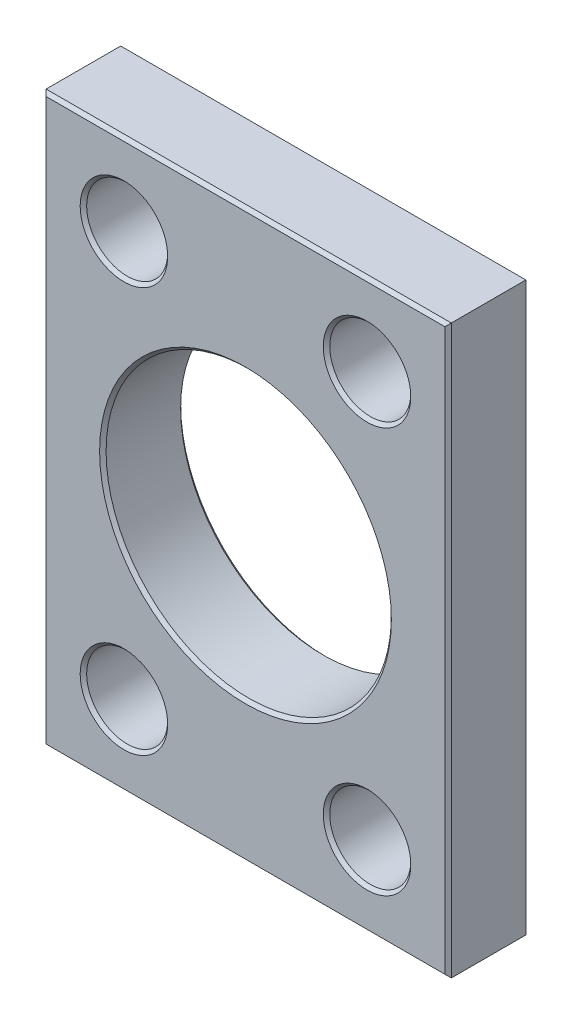
ISO-10303-21;
HEADER;
FILE_DESCRIPTION(('STEP AP214'),'2;1');
FILE_NAME('part.step','',(''),(''),'','','');
FILE_SCHEMA(('AUTOMOTIVE_DESIGN { 1 0 10303 214 1 1 1 1 }'));
ENDSEC;
DATA;
#1=APPLICATION_CONTEXT('core data for automotive mechanical design processes');
#2=APPLICATION_PROTOCOL_DEFINITION('international standard','automotive_design',2000,#1);
#3=PRODUCT_CONTEXT('',#1,'mechanical');
#4=PRODUCT('Part','Part','',(#3));
#5=PRODUCT_RELATED_PRODUCT_CATEGORY('part','',(#4));
#6=PRODUCT_DEFINITION_FORMATION('','',#4);
#7=PRODUCT_DEFINITION_CONTEXT('part definition',#1,'design');
#8=PRODUCT_DEFINITION('design','',#6,#7);
#9=PRODUCT_DEFINITION_SHAPE('','',#8);
#10=(LENGTH_UNIT() NAMED_UNIT(*) SI_UNIT(.MILLI.,.METRE.));
#11=(NAMED_UNIT(*) PLANE_ANGLE_UNIT() SI_UNIT($,.RADIAN.));
#12=(NAMED_UNIT(*) SI_UNIT($,.STERADIAN.) SOLID_ANGLE_UNIT());
#13=UNCERTAINTY_MEASURE_WITH_UNIT(LENGTH_MEASURE(1.E-05),#10,'distance_accuracy_value','');
#14=(GEOMETRIC_REPRESENTATION_CONTEXT(3) GLOBAL_UNCERTAINTY_ASSIGNED_CONTEXT((#13)) GLOBAL_UNIT_ASSIGNED_CONTEXT((#10,
#11,#12)) REPRESENTATION_CONTEXT('',''));
#15=CARTESIAN_POINT('',(0.,0.,0.));
#16=DIRECTION('',(0.,0.,1.));
#17=DIRECTION('',(1.,0.,0.));
#18=AXIS2_PLACEMENT_3D('',#15,#16,#17);
#19=CARTESIAN_POINT('',(0.,0.,6.35));
#20=DIRECTION('',(0.,0.,-1.));
#21=DIRECTION('',(-1.,0.,0.));
#22=AXIS2_PLACEMENT_3D('',#19,#20,#21);
#23=PLANE('',#22);
#24=CARTESIAN_POINT('',(0.,0.,6.35));
#25=DIRECTION('',(0.,0.,-1.));
#26=DIRECTION('',(-1.,0.,0.));
#27=AXIS2_PLACEMENT_3D('',#24,#25,#26);
#28=CIRCLE('',#27,11.43);
#29=CARTESIAN_POINT('',(-11.43,0.,6.35));
#30=VERTEX_POINT('',#29);
#31=EDGE_CURVE('E11',#30,#30,#28,.T.);
#32=ORIENTED_EDGE('',*,*,#31,.T.);
#33=EDGE_LOOP('',(#32));
#34=FACE_BOUND('',#33,.T.);
#35=CARTESIAN_POINT('',(9.525,-15.875,6.35));
#36=DIRECTION('',(0.,0.,-1.));
#37=DIRECTION('',(-1.,0.,0.));
#38=AXIS2_PLACEMENT_3D('',#35,#36,#37);
#39=CIRCLE('',#38,3.429);
#40=CARTESIAN_POINT('',(6.09599999999999,-15.875,6.35));
#41=VERTEX_POINT('',#40);
#42=EDGE_CURVE('E42',#41,#41,#39,.T.);
#43=ORIENTED_EDGE('',*,*,#42,.T.);
#44=EDGE_LOOP('',(#43));
#45=FACE_BOUND('',#44,.T.);
#46=CARTESIAN_POINT('',(-9.525,-15.875,6.35));
#47=DIRECTION('',(0.,0.,-1.));
#48=DIRECTION('',(-1.,0.,0.));
#49=AXIS2_PLACEMENT_3D('',#46,#47,#48);
#50=CIRCLE('',#49,3.429);
#51=CARTESIAN_POINT('',(-12.954,-15.875,6.35));
#52=VERTEX_POINT('',#51);
#53=EDGE_CURVE('E199',#52,#52,#50,.T.);
#54=ORIENTED_EDGE('',*,*,#53,.T.);
#55=EDGE_LOOP('',(#54));
#56=FACE_BOUND('',#55,.T.);
#57=CARTESIAN_POINT('',(9.525,15.875,6.35));
#58=DIRECTION('',(0.,0.,-1.));
#59=DIRECTION('',(-1.,0.,0.));
#60=AXIS2_PLACEMENT_3D('',#57,#58,#59);
#61=CIRCLE('',#60,3.429);
#62=CARTESIAN_POINT('',(6.096,15.875,6.35));
#63=VERTEX_POINT('',#62);
#64=EDGE_CURVE('E196',#63,#63,#61,.T.);
#65=ORIENTED_EDGE('',*,*,#64,.T.);
#66=EDGE_LOOP('',(#65));
#67=FACE_BOUND('',#66,.T.);
#68=CARTESIAN_POINT('',(-9.525,15.875,6.35));
#69=DIRECTION('',(0.,0.,-1.));
#70=DIRECTION('',(-1.,0.,0.));
#71=AXIS2_PLACEMENT_3D('',#68,#69,#70);
#72=CIRCLE('',#71,3.429);
#73=CARTESIAN_POINT('',(-12.954,15.875,6.35));
#74=VERTEX_POINT('',#73);
#75=EDGE_CURVE('E193',#74,#74,#72,.T.);
#76=ORIENTED_EDGE('',*,*,#75,.T.);
#77=EDGE_LOOP('',(#76));
#78=FACE_BOUND('',#77,.T.);
#79=DIRECTION('',(0.,-1.,0.));
#80=VECTOR('',#79,1.);
#81=CARTESIAN_POINT('',(-15.621,0.,6.35));
#82=LINE('',#81,#80);
#83=CARTESIAN_POINT('',(-15.621,21.971,6.35));
#84=VERTEX_POINT('',#83);
#85=CARTESIAN_POINT('',(-15.621,-21.971,6.35));
#86=VERTEX_POINT('',#85);
#87=EDGE_CURVE('E50',#84,#86,#82,.T.);
#88=ORIENTED_EDGE('',*,*,#87,.T.);
#89=DIRECTION('',(1.,0.,0.));
#90=VECTOR('',#89,1.);
#91=CARTESIAN_POINT('',(0.,-21.971,6.35));
#92=LINE('',#91,#90);
#93=CARTESIAN_POINT('',(15.621,-21.971,6.35));
#94=VERTEX_POINT('',#93);
#95=EDGE_CURVE('E191',#86,#94,#92,.T.);
#96=ORIENTED_EDGE('',*,*,#95,.T.);
#97=DIRECTION('',(0.,1.,0.));
#98=VECTOR('',#97,1.);
#99=CARTESIAN_POINT('',(15.621,0.,6.35));
#100=LINE('',#99,#98);
#101=CARTESIAN_POINT('',(15.621,21.971,6.35));
#102=VERTEX_POINT('',#101);
#103=EDGE_CURVE('E187',#94,#102,#100,.T.);
#104=ORIENTED_EDGE('',*,*,#103,.T.);
#105=DIRECTION('',(-1.,0.,0.));
#106=VECTOR('',#105,1.);
#107=CARTESIAN_POINT('',(0.,21.971,6.35));
#108=LINE('',#107,#106);
#109=EDGE_CURVE('E55',#102,#84,#108,.T.);
#110=ORIENTED_EDGE('',*,*,#109,.T.);
#111=EDGE_LOOP('',(#88,#96,#104,#110));
#112=FACE_BOUND('',#111,.T.);
#113=ADVANCED_FACE('F33',(#34,#45,#56,#67,#78,#112),#23,.F.);
#114=CARTESIAN_POINT('',(0.,0.,0.));
#115=DIRECTION('',(0.,0.,-1.));
#116=DIRECTION('',(-1.,0.,0.));
#117=AXIS2_PLACEMENT_3D('',#114,#115,#116);
#118=PLANE('',#117);
#119=CARTESIAN_POINT('',(0.,0.,0.));
#120=DIRECTION('',(0.,0.,-1.));
#121=DIRECTION('',(-1.,0.,0.));
#122=AXIS2_PLACEMENT_3D('',#119,#120,#121);
#123=CIRCLE('',#122,11.43);
#124=CARTESIAN_POINT('',(-11.43,0.,0.));
#125=VERTEX_POINT('',#124);
#126=EDGE_CURVE('E138',#125,#125,#123,.F.);
#127=ORIENTED_EDGE('',*,*,#126,.T.);
#128=EDGE_LOOP('',(#127));
#129=FACE_BOUND('',#128,.T.);
#130=CARTESIAN_POINT('',(-9.525,-15.875,0.));
#131=DIRECTION('',(0.,0.,-1.));
#132=DIRECTION('',(-1.,0.,0.));
#133=AXIS2_PLACEMENT_3D('',#130,#131,#132);
#134=CIRCLE('',#133,3.429);
#135=CARTESIAN_POINT('',(-12.954,-15.875,0.));
#136=VERTEX_POINT('',#135);
#137=EDGE_CURVE('E131',#136,#136,#134,.F.);
#138=ORIENTED_EDGE('',*,*,#137,.T.);
#139=EDGE_LOOP('',(#138));
#140=FACE_BOUND('',#139,.T.);
#141=CARTESIAN_POINT('',(-9.525,15.875,0.));
#142=DIRECTION('',(0.,0.,-1.));
#143=DIRECTION('',(-1.,0.,0.));
#144=AXIS2_PLACEMENT_3D('',#141,#142,#143);
#145=CIRCLE('',#144,3.429);
#146=CARTESIAN_POINT('',(-12.954,15.875,0.));
#147=VERTEX_POINT('',#146);
#148=EDGE_CURVE('E128',#147,#147,#145,.F.);
#149=ORIENTED_EDGE('',*,*,#148,.T.);
#150=EDGE_LOOP('',(#149));
#151=FACE_BOUND('',#150,.T.);
#152=DIRECTION('',(0.,1.,0.));
#153=VECTOR('',#152,1.);
#154=CARTESIAN_POINT('',(-15.621,22.225,0.));
#155=LINE('',#154,#153);
#156=CARTESIAN_POINT('',(-15.621,-21.971,0.));
#157=VERTEX_POINT('',#156);
#158=CARTESIAN_POINT('',(-15.621,21.971,0.));
#159=VERTEX_POINT('',#158);
#160=EDGE_CURVE('E127',#157,#159,#155,.T.);
#161=ORIENTED_EDGE('',*,*,#160,.T.);
#162=DIRECTION('',(1.,0.,0.));
#163=VECTOR('',#162,1.);
#164=CARTESIAN_POINT('',(15.875,21.971,0.));
#165=LINE('',#164,#163);
#166=CARTESIAN_POINT('',(15.621,21.971,0.));
#167=VERTEX_POINT('',#166);
#168=EDGE_CURVE('E105',#159,#167,#165,.T.);
#169=ORIENTED_EDGE('',*,*,#168,.T.);
#170=DIRECTION('',(0.,-1.,0.));
#171=VECTOR('',#170,1.);
#172=CARTESIAN_POINT('',(15.621,-22.225,0.));
#173=LINE('',#172,#171);
#174=CARTESIAN_POINT('',(15.621,-21.971,0.));
#175=VERTEX_POINT('',#174);
#176=EDGE_CURVE('E115',#167,#175,#173,.T.);
#177=ORIENTED_EDGE('',*,*,#176,.T.);
#178=DIRECTION('',(-1.,0.,0.));
#179=VECTOR('',#178,1.);
#180=CARTESIAN_POINT('',(-15.875,-21.971,0.));
#181=LINE('',#180,#179);
#182=EDGE_CURVE('E121',#175,#157,#181,.T.);
#183=ORIENTED_EDGE('',*,*,#182,.T.);
#184=EDGE_LOOP('',(#161,#169,#177,#183));
#185=FACE_BOUND('',#184,.T.);
#186=CARTESIAN_POINT('',(9.525,15.875,0.));
#187=DIRECTION('',(0.,0.,-1.));
#188=DIRECTION('',(-1.,0.,0.));
#189=AXIS2_PLACEMENT_3D('',#186,#187,#188);
#190=CIRCLE('',#189,3.42899999999999);
#191=CARTESIAN_POINT('',(6.09600000000001,15.875,0.));
#192=VERTEX_POINT('',#191);
#193=EDGE_CURVE('E122',#192,#192,#190,.F.);
#194=ORIENTED_EDGE('',*,*,#193,.T.);
#195=EDGE_LOOP('',(#194));
#196=FACE_BOUND('',#195,.T.);
#197=CARTESIAN_POINT('',(9.525,-15.875,0.));
#198=DIRECTION('',(0.,0.,-1.));
#199=DIRECTION('',(-1.,0.,0.));
#200=AXIS2_PLACEMENT_3D('',#197,#198,#199);
#201=CIRCLE('',#200,3.429);
#202=CARTESIAN_POINT('',(6.09599999999999,-15.875,0.));
#203=VERTEX_POINT('',#202);
#204=EDGE_CURVE('E236',#203,#203,#201,.F.);
#205=ORIENTED_EDGE('',*,*,#204,.T.);
#206=EDGE_LOOP('',(#205));
#207=FACE_BOUND('',#206,.T.);
#208=ADVANCED_FACE('F124',(#129,#140,#151,#185,#196,#207),#118,.T.);
#209=CARTESIAN_POINT('',(15.875,-22.225,6.35));
#210=DIRECTION('',(-1.,0.,0.));
#211=DIRECTION('',(0.,-1.,0.));
#212=AXIS2_PLACEMENT_3D('',#209,#210,#211);
#213=PLANE('',#212);
#214=DIRECTION('',(0.,0.,-1.));
#215=VECTOR('',#214,1.);
#216=CARTESIAN_POINT('',(15.875,-22.225,6.35));
#217=LINE('',#216,#215);
#218=CARTESIAN_POINT('',(15.875,-22.225,6.096));
#219=VERTEX_POINT('',#218);
#220=CARTESIAN_POINT('',(15.875,-22.225,0.253999999999997));
#221=VERTEX_POINT('',#220);
#222=EDGE_CURVE('E208',#219,#221,#217,.T.);
#223=ORIENTED_EDGE('',*,*,#222,.T.);
#224=DIRECTION('',(0.,1.,0.));
#225=VECTOR('',#224,1.);
#226=CARTESIAN_POINT('',(15.875,22.225,0.253999999999997));
#227=LINE('',#226,#225);
#228=CARTESIAN_POINT('',(15.875,22.225,0.253999999999997));
#229=VERTEX_POINT('',#228);
#230=EDGE_CURVE('E173',#221,#229,#227,.T.);
#231=ORIENTED_EDGE('',*,*,#230,.T.);
#232=DIRECTION('',(0.,0.,-1.));
#233=VECTOR('',#232,1.);
#234=CARTESIAN_POINT('',(15.875,22.225,6.35));
#235=LINE('',#234,#233);
#236=CARTESIAN_POINT('',(15.875,22.225,6.096));
#237=VERTEX_POINT('',#236);
#238=EDGE_CURVE('E229',#237,#229,#235,.T.);
#239=ORIENTED_EDGE('',*,*,#238,.F.);
#240=DIRECTION('',(0.,-1.,0.));
#241=VECTOR('',#240,1.);
#242=CARTESIAN_POINT('',(15.875,-22.225,6.096));
#243=LINE('',#242,#241);
#244=EDGE_CURVE('E171',#237,#219,#243,.T.);
#245=ORIENTED_EDGE('',*,*,#244,.T.);
#246=EDGE_LOOP('',(#223,#231,#239,#245));
#247=FACE_BOUND('',#246,.T.);
#248=ADVANCED_FACE('F234',(#247),#213,.F.);
#249=CARTESIAN_POINT('',(-15.875,22.225,6.35));
#250=DIRECTION('',(0.,-1.,0.));
#251=DIRECTION('',(0.,0.,-1.));
#252=AXIS2_PLACEMENT_3D('',#249,#250,#251);
#253=PLANE('',#252);
#254=ORIENTED_EDGE('',*,*,#238,.T.);
#255=DIRECTION('',(-1.,0.,0.));
#256=VECTOR('',#255,1.);
#257=CARTESIAN_POINT('',(-15.875,22.225,0.253999999999997));
#258=LINE('',#257,#256);
#259=CARTESIAN_POINT('',(-15.875,22.225,0.253999999999997));
#260=VERTEX_POINT('',#259);
#261=EDGE_CURVE('E108',#229,#260,#258,.T.);
#262=ORIENTED_EDGE('',*,*,#261,.T.);
#263=DIRECTION('',(0.,0.,-1.));
#264=VECTOR('',#263,1.);
#265=CARTESIAN_POINT('',(-15.875,22.225,6.35));
#266=LINE('',#265,#264);
#267=CARTESIAN_POINT('',(-15.875,22.225,6.096));
#268=VERTEX_POINT('',#267);
#269=EDGE_CURVE('E231',#268,#260,#266,.T.);
#270=ORIENTED_EDGE('',*,*,#269,.F.);
#271=DIRECTION('',(1.,0.,0.));
#272=VECTOR('',#271,1.);
#273=CARTESIAN_POINT('',(-15.875,22.225,6.096));
#274=LINE('',#273,#272);
#275=EDGE_CURVE('E159',#268,#237,#274,.T.);
#276=ORIENTED_EDGE('',*,*,#275,.T.);
#277=EDGE_LOOP('',(#254,#262,#270,#276));
#278=FACE_BOUND('',#277,.T.);
#279=ADVANCED_FACE('F228',(#278),#253,.F.);
#280=CARTESIAN_POINT('',(-15.875,-22.225,6.35));
#281=DIRECTION('',(1.,0.,0.));
#282=DIRECTION('',(0.,1.,0.));
#283=AXIS2_PLACEMENT_3D('',#280,#281,#282);
#284=PLANE('',#283);
#285=ORIENTED_EDGE('',*,*,#269,.T.);
#286=DIRECTION('',(0.,-1.,0.));
#287=VECTOR('',#286,1.);
#288=CARTESIAN_POINT('',(-15.875,-22.225,0.253999999999997));
#289=LINE('',#288,#287);
#290=CARTESIAN_POINT('',(-15.875,-22.225,0.253999999999997));
#291=VERTEX_POINT('',#290);
#292=EDGE_CURVE('E164',#260,#291,#289,.T.);
#293=ORIENTED_EDGE('',*,*,#292,.T.);
#294=DIRECTION('',(0.,0.,-1.));
#295=VECTOR('',#294,1.);
#296=CARTESIAN_POINT('',(-15.875,-22.225,6.35));
#297=LINE('',#296,#295);
#298=CARTESIAN_POINT('',(-15.875,-22.225,6.096));
#299=VERTEX_POINT('',#298);
#300=EDGE_CURVE('E240',#299,#291,#297,.T.);
#301=ORIENTED_EDGE('',*,*,#300,.F.);
#302=DIRECTION('',(0.,1.,0.));
#303=VECTOR('',#302,1.);
#304=CARTESIAN_POINT('',(-15.875,-22.225,6.096));
#305=LINE('',#304,#303);
#306=EDGE_CURVE('E162',#299,#268,#305,.T.);
#307=ORIENTED_EDGE('',*,*,#306,.T.);
#308=EDGE_LOOP('',(#285,#293,#301,#307));
#309=FACE_BOUND('',#308,.T.);
#310=ADVANCED_FACE('F255',(#309),#284,.F.);
#311=CARTESIAN_POINT('',(-15.875,-22.225,6.35));
#312=DIRECTION('',(0.,1.,0.));
#313=DIRECTION('',(0.,0.,1.));
#314=AXIS2_PLACEMENT_3D('',#311,#312,#313);
#315=PLANE('',#314);
#316=ORIENTED_EDGE('',*,*,#300,.T.);
#317=DIRECTION('',(1.,0.,0.));
#318=VECTOR('',#317,1.);
#319=CARTESIAN_POINT('',(15.875,-22.225,0.253999999999997));
#320=LINE('',#319,#318);
#321=EDGE_CURVE('E169',#291,#221,#320,.T.);
#322=ORIENTED_EDGE('',*,*,#321,.T.);
#323=ORIENTED_EDGE('',*,*,#222,.F.);
#324=DIRECTION('',(-1.,0.,0.));
#325=VECTOR('',#324,1.);
#326=CARTESIAN_POINT('',(-15.875,-22.225,6.096));
#327=LINE('',#326,#325);
#328=EDGE_CURVE('E166',#219,#299,#327,.T.);
#329=ORIENTED_EDGE('',*,*,#328,.T.);
#330=EDGE_LOOP('',(#316,#322,#323,#329));
#331=FACE_BOUND('',#330,.T.);
#332=ADVANCED_FACE('F259',(#331),#315,.F.);
#333=CARTESIAN_POINT('',(-9.525,15.875,6.35));
#334=DIRECTION('',(0.,0.,-1.));
#335=DIRECTION('',(-1.,0.,0.));
#336=AXIS2_PLACEMENT_3D('',#333,#334,#335);
#337=CYLINDRICAL_SURFACE('',#336,3.175);
#338=CARTESIAN_POINT('',(-9.525,15.875,0.254000000000004));
#339=DIRECTION('',(0.,0.,-1.));
#340=DIRECTION('',(-1.,0.,0.));
#341=AXIS2_PLACEMENT_3D('',#338,#339,#340);
#342=CIRCLE('',#341,3.175);
#343=CARTESIAN_POINT('',(-12.7,15.875,0.254000000000004));
#344=VERTEX_POINT('',#343);
#345=EDGE_CURVE('E156',#344,#344,#342,.T.);
#346=ORIENTED_EDGE('',*,*,#345,.T.);
#347=EDGE_LOOP('',(#346));
#348=FACE_BOUND('',#347,.T.);
#349=CARTESIAN_POINT('',(-9.525,15.875,6.096));
#350=DIRECTION('',(0.,0.,-1.));
#351=DIRECTION('',(-1.,0.,0.));
#352=AXIS2_PLACEMENT_3D('',#349,#350,#351);
#353=CIRCLE('',#352,3.175);
#354=CARTESIAN_POINT('',(-12.7,15.875,6.096));
#355=VERTEX_POINT('',#354);
#356=EDGE_CURVE('E153',#355,#355,#353,.F.);
#357=ORIENTED_EDGE('',*,*,#356,.T.);
#358=EDGE_LOOP('',(#357));
#359=FACE_BOUND('',#358,.T.);
#360=ADVANCED_FACE('F275',(#348,#359),#337,.F.);
#361=CARTESIAN_POINT('',(9.525,15.875,6.35));
#362=DIRECTION('',(0.,0.,-1.));
#363=DIRECTION('',(-1.,0.,0.));
#364=AXIS2_PLACEMENT_3D('',#361,#362,#363);
#365=CYLINDRICAL_SURFACE('',#364,3.175);
#366=CARTESIAN_POINT('',(9.525,15.875,0.25399999999999));
#367=DIRECTION('',(0.,0.,-1.));
#368=DIRECTION('',(-1.,0.,0.));
#369=AXIS2_PLACEMENT_3D('',#366,#367,#368);
#370=CIRCLE('',#369,3.175);
#371=CARTESIAN_POINT('',(6.35,15.875,0.25399999999999));
#372=VERTEX_POINT('',#371);
#373=EDGE_CURVE('E178',#372,#372,#370,.T.);
#374=ORIENTED_EDGE('',*,*,#373,.T.);
#375=EDGE_LOOP('',(#374));
#376=FACE_BOUND('',#375,.T.);
#377=CARTESIAN_POINT('',(9.525,15.875,6.096));
#378=DIRECTION('',(0.,0.,-1.));
#379=DIRECTION('',(-1.,0.,0.));
#380=AXIS2_PLACEMENT_3D('',#377,#378,#379);
#381=CIRCLE('',#380,3.175);
#382=CARTESIAN_POINT('',(6.35,15.875,6.096));
#383=VERTEX_POINT('',#382);
#384=EDGE_CURVE('E175',#383,#383,#381,.F.);
#385=ORIENTED_EDGE('',*,*,#384,.T.);
#386=EDGE_LOOP('',(#385));
#387=FACE_BOUND('',#386,.T.);
#388=ADVANCED_FACE('F422',(#376,#387),#365,.F.);
#389=CARTESIAN_POINT('',(-9.525,-15.875,6.35));
#390=DIRECTION('',(0.,0.,-1.));
#391=DIRECTION('',(-1.,0.,0.));
#392=AXIS2_PLACEMENT_3D('',#389,#390,#391);
#393=CYLINDRICAL_SURFACE('',#392,3.175);
#394=CARTESIAN_POINT('',(-9.525,-15.875,0.254000000000004));
#395=DIRECTION('',(0.,0.,-1.));
#396=DIRECTION('',(-1.,0.,0.));
#397=AXIS2_PLACEMENT_3D('',#394,#395,#396);
#398=CIRCLE('',#397,3.175);
#399=CARTESIAN_POINT('',(-12.7,-15.875,0.254000000000004));
#400=VERTEX_POINT('',#399);
#401=EDGE_CURVE('E150',#400,#400,#398,.T.);
#402=ORIENTED_EDGE('',*,*,#401,.T.);
#403=EDGE_LOOP('',(#402));
#404=FACE_BOUND('',#403,.T.);
#405=CARTESIAN_POINT('',(-9.525,-15.875,6.096));
#406=DIRECTION('',(0.,0.,-1.));
#407=DIRECTION('',(-1.,0.,0.));
#408=AXIS2_PLACEMENT_3D('',#405,#406,#407);
#409=CIRCLE('',#408,3.175);
#410=CARTESIAN_POINT('',(-12.7,-15.875,6.096));
#411=VERTEX_POINT('',#410);
#412=EDGE_CURVE('E147',#411,#411,#409,.F.);
#413=ORIENTED_EDGE('',*,*,#412,.T.);
#414=EDGE_LOOP('',(#413));
#415=FACE_BOUND('',#414,.T.);
#416=ADVANCED_FACE('F414',(#404,#415),#393,.F.);
#417=CARTESIAN_POINT('',(9.525,-15.875,6.35));
#418=DIRECTION('',(0.,0.,-1.));
#419=DIRECTION('',(-1.,0.,0.));
#420=AXIS2_PLACEMENT_3D('',#417,#418,#419);
#421=CYLINDRICAL_SURFACE('',#420,3.175);
#422=CARTESIAN_POINT('',(9.525,-15.875,0.253999999999996));
#423=DIRECTION('',(0.,0.,-1.));
#424=DIRECTION('',(-1.,0.,0.));
#425=AXIS2_PLACEMENT_3D('',#422,#423,#424);
#426=CIRCLE('',#425,3.175);
#427=CARTESIAN_POINT('',(6.34999999999999,-15.875,0.253999999999996));
#428=VERTEX_POINT('',#427);
#429=EDGE_CURVE('E184',#428,#428,#426,.T.);
#430=ORIENTED_EDGE('',*,*,#429,.T.);
#431=EDGE_LOOP('',(#430));
#432=FACE_BOUND('',#431,.T.);
#433=CARTESIAN_POINT('',(9.525,-15.875,6.096));
#434=DIRECTION('',(0.,0.,-1.));
#435=DIRECTION('',(-1.,0.,0.));
#436=AXIS2_PLACEMENT_3D('',#433,#434,#435);
#437=CIRCLE('',#436,3.175);
#438=CARTESIAN_POINT('',(6.34999999999999,-15.875,6.096));
#439=VERTEX_POINT('',#438);
#440=EDGE_CURVE('E181',#439,#439,#437,.F.);
#441=ORIENTED_EDGE('',*,*,#440,.T.);
#442=EDGE_LOOP('',(#441));
#443=FACE_BOUND('',#442,.T.);
#444=ADVANCED_FACE('F406',(#432,#443),#421,.F.);
#445=CARTESIAN_POINT('',(0.,0.,6.35));
#446=DIRECTION('',(0.,0.,-1.));
#447=DIRECTION('',(-1.,0.,0.));
#448=AXIS2_PLACEMENT_3D('',#445,#446,#447);
#449=CYLINDRICAL_SURFACE('',#448,11.176);
#450=CARTESIAN_POINT('',(0.,0.,0.254000000000004));
#451=DIRECTION('',(0.,0.,-1.));
#452=DIRECTION('',(-1.,0.,0.));
#453=AXIS2_PLACEMENT_3D('',#450,#451,#452);
#454=CIRCLE('',#453,11.176);
#455=CARTESIAN_POINT('',(-11.176,0.,0.254000000000004));
#456=VERTEX_POINT('',#455);
#457=EDGE_CURVE('E144',#456,#456,#454,.T.);
#458=ORIENTED_EDGE('',*,*,#457,.T.);
#459=EDGE_LOOP('',(#458));
#460=FACE_BOUND('',#459,.T.);
#461=CARTESIAN_POINT('',(0.,0.,6.09599999999999));
#462=DIRECTION('',(0.,0.,-1.));
#463=DIRECTION('',(-1.,0.,0.));
#464=AXIS2_PLACEMENT_3D('',#461,#462,#463);
#465=CIRCLE('',#464,11.176);
#466=CARTESIAN_POINT('',(-11.176,0.,6.09599999999999));
#467=VERTEX_POINT('',#466);
#468=EDGE_CURVE('E141',#467,#467,#465,.F.);
#469=ORIENTED_EDGE('',*,*,#468,.T.);
#470=EDGE_LOOP('',(#469));
#471=FACE_BOUND('',#470,.T.);
#472=ADVANCED_FACE('F290',(#460,#471),#449,.F.);
#473=CARTESIAN_POINT('',(0.,0.,0.));
#474=DIRECTION('',(0.,0.,-1.));
#475=DIRECTION('',(-1.,0.,0.));
#476=AXIS2_PLACEMENT_3D('',#473,#474,#475);
#477=CONICAL_SURFACE('',#476,11.43,0.785398163397438);
#478=ORIENTED_EDGE('',*,*,#457,.F.);
#479=EDGE_LOOP('',(#478));
#480=FACE_BOUND('',#479,.T.);
#481=ORIENTED_EDGE('',*,*,#126,.F.);
#482=EDGE_LOOP('',(#481));
#483=FACE_BOUND('',#482,.T.);
#484=ADVANCED_FACE('F286',(#480,#483),#477,.F.);
#485=CARTESIAN_POINT('',(-9.525,-15.875,0.));
#486=DIRECTION('',(0.,0.,-1.));
#487=DIRECTION('',(-1.,0.,0.));
#488=AXIS2_PLACEMENT_3D('',#485,#486,#487);
#489=CONICAL_SURFACE('',#488,3.429,0.785398163397443);
#490=ORIENTED_EDGE('',*,*,#401,.F.);
#491=EDGE_LOOP('',(#490));
#492=FACE_BOUND('',#491,.T.);
#493=ORIENTED_EDGE('',*,*,#137,.F.);
#494=EDGE_LOOP('',(#493));
#495=FACE_BOUND('',#494,.T.);
#496=ADVANCED_FACE('F289',(#492,#495),#489,.F.);
#497=CARTESIAN_POINT('',(-9.525,15.875,0.));
#498=DIRECTION('',(0.,0.,-1.));
#499=DIRECTION('',(-1.,0.,0.));
#500=AXIS2_PLACEMENT_3D('',#497,#498,#499);
#501=CONICAL_SURFACE('',#500,3.429,0.785398163397447);
#502=ORIENTED_EDGE('',*,*,#345,.F.);
#503=EDGE_LOOP('',(#502));
#504=FACE_BOUND('',#503,.T.);
#505=ORIENTED_EDGE('',*,*,#148,.F.);
#506=EDGE_LOOP('',(#505));
#507=FACE_BOUND('',#506,.T.);
#508=ADVANCED_FACE('F294',(#504,#507),#501,.F.);
#509=CARTESIAN_POINT('',(-15.875,-22.225,0.253999999999997));
#510=DIRECTION('',(0.,-0.707106781186538,-0.707106781186557));
#511=DIRECTION('',(-1.,0.,0.));
#512=AXIS2_PLACEMENT_3D('',#509,#510,#511);
#513=PLANE('',#512);
#514=DIRECTION('',(0.577350269189631,0.577350269189631,-0.577350269189615));
#515=VECTOR('',#514,1.);
#516=CARTESIAN_POINT('',(-15.875,-22.225,0.253999999999997));
#517=LINE('',#516,#515);
#518=EDGE_CURVE('E111',#157,#291,#517,.F.);
#519=ORIENTED_EDGE('',*,*,#518,.F.);
#520=ORIENTED_EDGE('',*,*,#182,.F.);
#521=DIRECTION('',(-0.577350269189631,0.577350269189631,-0.577350269189615));
#522=VECTOR('',#521,1.);
#523=CARTESIAN_POINT('',(15.875,-22.225,0.253999999999997));
#524=LINE('',#523,#522);
#525=EDGE_CURVE('E118',#221,#175,#524,.T.);
#526=ORIENTED_EDGE('',*,*,#525,.F.);
#527=ORIENTED_EDGE('',*,*,#321,.F.);
#528=EDGE_LOOP('',(#519,#520,#526,#527));
#529=FACE_BOUND('',#528,.T.);
#530=ADVANCED_FACE('F248',(#529),#513,.T.);
#531=CARTESIAN_POINT('',(15.875,-22.225,0.253999999999997));
#532=DIRECTION('',(0.707106781186538,0.,-0.707106781186557));
#533=DIRECTION('',(0.,-1.,0.));
#534=AXIS2_PLACEMENT_3D('',#531,#532,#533);
#535=PLANE('',#534);
#536=ORIENTED_EDGE('',*,*,#525,.T.);
#537=ORIENTED_EDGE('',*,*,#176,.F.);
#538=DIRECTION('',(0.577350269189631,0.577350269189631,0.577350269189615));
#539=VECTOR('',#538,1.);
#540=CARTESIAN_POINT('',(1.05833333333307,7.40833333333307,-14.5626666666665));
#541=LINE('',#540,#539);
#542=EDGE_CURVE('E101',#229,#167,#541,.F.);
#543=ORIENTED_EDGE('',*,*,#542,.F.);
#544=ORIENTED_EDGE('',*,*,#230,.F.);
#545=EDGE_LOOP('',(#536,#537,#543,#544));
#546=FACE_BOUND('',#545,.T.);
#547=ADVANCED_FACE('F116',(#546),#535,.T.);
#548=CARTESIAN_POINT('',(-15.875,-22.225,0.253999999999997));
#549=DIRECTION('',(-0.707106781186538,0.,-0.707106781186557));
#550=DIRECTION('',(0.,1.,0.));
#551=AXIS2_PLACEMENT_3D('',#548,#549,#550);
#552=PLANE('',#551);
#553=ORIENTED_EDGE('',*,*,#518,.T.);
#554=ORIENTED_EDGE('',*,*,#292,.F.);
#555=DIRECTION('',(0.577350269189631,-0.577350269189631,-0.577350269189615));
#556=VECTOR('',#555,1.);
#557=CARTESIAN_POINT('',(-1.05833333333307,7.40833333333307,-14.5626666666665));
#558=LINE('',#557,#556);
#559=EDGE_CURVE('E112',#159,#260,#558,.F.);
#560=ORIENTED_EDGE('',*,*,#559,.F.);
#561=ORIENTED_EDGE('',*,*,#160,.F.);
#562=EDGE_LOOP('',(#553,#554,#560,#561));
#563=FACE_BOUND('',#562,.T.);
#564=ADVANCED_FACE('F251',(#563),#552,.T.);
#565=CARTESIAN_POINT('',(-15.875,22.225,0.253999999999997));
#566=DIRECTION('',(0.,0.707106781186538,-0.707106781186557));
#567=DIRECTION('',(1.,0.,0.));
#568=AXIS2_PLACEMENT_3D('',#565,#566,#567);
#569=PLANE('',#568);
#570=ORIENTED_EDGE('',*,*,#542,.T.);
#571=ORIENTED_EDGE('',*,*,#168,.F.);
#572=ORIENTED_EDGE('',*,*,#559,.T.);
#573=ORIENTED_EDGE('',*,*,#261,.F.);
#574=EDGE_LOOP('',(#570,#571,#572,#573));
#575=FACE_BOUND('',#574,.T.);
#576=ADVANCED_FACE('F103',(#575),#569,.T.);
#577=CARTESIAN_POINT('',(9.525,15.875,0.));
#578=DIRECTION('',(0.,0.,-1.));
#579=DIRECTION('',(-1.,0.,0.));
#580=AXIS2_PLACEMENT_3D('',#577,#578,#579);
#581=CONICAL_SURFACE('',#580,3.42899999999999,0.785398163397457);
#582=ORIENTED_EDGE('',*,*,#373,.F.);
#583=EDGE_LOOP('',(#582));
#584=FACE_BOUND('',#583,.T.);
#585=ORIENTED_EDGE('',*,*,#193,.F.);
#586=EDGE_LOOP('',(#585));
#587=FACE_BOUND('',#586,.T.);
#588=ADVANCED_FACE('F301',(#584,#587),#581,.F.);
#589=CARTESIAN_POINT('',(9.525,-15.875,0.));
#590=DIRECTION('',(0.,0.,-1.));
#591=DIRECTION('',(-1.,0.,0.));
#592=AXIS2_PLACEMENT_3D('',#589,#590,#591);
#593=CONICAL_SURFACE('',#592,3.429,0.785398163397456);
#594=ORIENTED_EDGE('',*,*,#429,.F.);
#595=EDGE_LOOP('',(#594));
#596=FACE_BOUND('',#595,.T.);
#597=ORIENTED_EDGE('',*,*,#204,.F.);
#598=EDGE_LOOP('',(#597));
#599=FACE_BOUND('',#598,.T.);
#600=ADVANCED_FACE('F310',(#596,#599),#593,.F.);
#601=CARTESIAN_POINT('',(0.,0.,6.09599999999999));
#602=DIRECTION('',(0.,0.,1.));
#603=DIRECTION('',(1.,0.,0.));
#604=AXIS2_PLACEMENT_3D('',#601,#602,#603);
#605=CONICAL_SURFACE('',#604,11.176,0.785398163397455);
#606=ORIENTED_EDGE('',*,*,#31,.F.);
#607=EDGE_LOOP('',(#606));
#608=FACE_BOUND('',#607,.T.);
#609=ORIENTED_EDGE('',*,*,#468,.F.);
#610=EDGE_LOOP('',(#609));
#611=FACE_BOUND('',#610,.T.);
#612=ADVANCED_FACE('F314',(#608,#611),#605,.F.);
#613=CARTESIAN_POINT('',(9.525,-15.875,6.096));
#614=DIRECTION('',(0.,0.,1.));
#615=DIRECTION('',(1.,0.,0.));
#616=AXIS2_PLACEMENT_3D('',#613,#614,#615);
#617=CONICAL_SURFACE('',#616,3.175,0.785398163397454);
#618=ORIENTED_EDGE('',*,*,#42,.F.);
#619=EDGE_LOOP('',(#618));
#620=FACE_BOUND('',#619,.T.);
#621=ORIENTED_EDGE('',*,*,#440,.F.);
#622=EDGE_LOOP('',(#621));
#623=FACE_BOUND('',#622,.T.);
#624=ADVANCED_FACE('F318',(#620,#623),#617,.F.);
#625=CARTESIAN_POINT('',(-9.525,-15.875,6.096));
#626=DIRECTION('',(0.,0.,1.));
#627=DIRECTION('',(1.,0.,0.));
#628=AXIS2_PLACEMENT_3D('',#625,#626,#627);
#629=CONICAL_SURFACE('',#628,3.175,0.785398163397453);
#630=ORIENTED_EDGE('',*,*,#53,.F.);
#631=EDGE_LOOP('',(#630));
#632=FACE_BOUND('',#631,.T.);
#633=ORIENTED_EDGE('',*,*,#412,.F.);
#634=EDGE_LOOP('',(#633));
#635=FACE_BOUND('',#634,.T.);
#636=ADVANCED_FACE('F322',(#632,#635),#629,.F.);
#637=CARTESIAN_POINT('',(9.525,15.875,6.096));
#638=DIRECTION('',(0.,0.,1.));
#639=DIRECTION('',(1.,0.,0.));
#640=AXIS2_PLACEMENT_3D('',#637,#638,#639);
#641=CONICAL_SURFACE('',#640,3.175,0.785398163397455);
#642=ORIENTED_EDGE('',*,*,#64,.F.);
#643=EDGE_LOOP('',(#642));
#644=FACE_BOUND('',#643,.T.);
#645=ORIENTED_EDGE('',*,*,#384,.F.);
#646=EDGE_LOOP('',(#645));
#647=FACE_BOUND('',#646,.T.);
#648=ADVANCED_FACE('F326',(#644,#647),#641,.F.);
#649=CARTESIAN_POINT('',(-9.525,15.875,6.096));
#650=DIRECTION('',(0.,0.,1.));
#651=DIRECTION('',(1.,0.,0.));
#652=AXIS2_PLACEMENT_3D('',#649,#650,#651);
#653=CONICAL_SURFACE('',#652,3.175,0.785398163397457);
#654=ORIENTED_EDGE('',*,*,#75,.F.);
#655=EDGE_LOOP('',(#654));
#656=FACE_BOUND('',#655,.T.);
#657=ORIENTED_EDGE('',*,*,#356,.F.);
#658=EDGE_LOOP('',(#657));
#659=FACE_BOUND('',#658,.T.);
#660=ADVANCED_FACE('F330',(#656,#659),#653,.F.);
#661=CARTESIAN_POINT('',(0.,21.971,6.35));
#662=DIRECTION('',(0.,-0.707106781186538,-0.707106781186557));
#663=DIRECTION('',(-1.,0.,0.));
#664=AXIS2_PLACEMENT_3D('',#661,#662,#663);
#665=PLANE('',#664);
#666=DIRECTION('',(-0.577350269189631,-0.577350269189631,0.577350269189615));
#667=VECTOR('',#666,1.);
#668=CARTESIAN_POINT('',(8.29733333333319,14.6473333333332,13.6736666666666));
#669=LINE('',#668,#667);
#670=EDGE_CURVE('E212',#237,#102,#669,.T.);
#671=ORIENTED_EDGE('',*,*,#670,.F.);
#672=ORIENTED_EDGE('',*,*,#275,.F.);
#673=DIRECTION('',(0.577350269189631,-0.577350269189631,0.577350269189615));
#674=VECTOR('',#673,1.);
#675=CARTESIAN_POINT('',(-10.4139999999999,16.7639999999999,11.5569999999999));
#676=LINE('',#675,#674);
#677=EDGE_CURVE('E37',#84,#268,#676,.F.);
#678=ORIENTED_EDGE('',*,*,#677,.F.);
#679=ORIENTED_EDGE('',*,*,#109,.F.);
#680=EDGE_LOOP('',(#671,#672,#678,#679));
#681=FACE_BOUND('',#680,.T.);
#682=ADVANCED_FACE('F35',(#681),#665,.F.);
#683=CARTESIAN_POINT('',(-15.621,0.,6.35));
#684=DIRECTION('',(0.707106781186538,0.,-0.707106781186557));
#685=DIRECTION('',(0.,-1.,0.));
#686=AXIS2_PLACEMENT_3D('',#683,#684,#685);
#687=PLANE('',#686);
#688=ORIENTED_EDGE('',*,*,#677,.T.);
#689=ORIENTED_EDGE('',*,*,#306,.F.);
#690=DIRECTION('',(0.577350269189631,0.577350269189631,0.577350269189615));
#691=VECTOR('',#690,1.);
#692=CARTESIAN_POINT('',(-8.2973333333332,-14.6473333333332,13.6736666666666));
#693=LINE('',#692,#691);
#694=EDGE_CURVE('E211',#86,#299,#693,.F.);
#695=ORIENTED_EDGE('',*,*,#694,.F.);
#696=ORIENTED_EDGE('',*,*,#87,.F.);
#697=EDGE_LOOP('',(#688,#689,#695,#696));
#698=FACE_BOUND('',#697,.T.);
#699=ADVANCED_FACE('F221',(#698),#687,.F.);
#700=CARTESIAN_POINT('',(15.621,0.,6.35));
#701=DIRECTION('',(-0.707106781186538,0.,-0.707106781186557));
#702=DIRECTION('',(0.,1.,0.));
#703=AXIS2_PLACEMENT_3D('',#700,#701,#702);
#704=PLANE('',#703);
#705=ORIENTED_EDGE('',*,*,#670,.T.);
#706=ORIENTED_EDGE('',*,*,#103,.F.);
#707=DIRECTION('',(0.577350269189631,-0.577350269189631,-0.577350269189615));
#708=VECTOR('',#707,1.);
#709=CARTESIAN_POINT('',(8.2973333333332,-14.6473333333332,13.6736666666666));
#710=LINE('',#709,#708);
#711=EDGE_CURVE('E209',#219,#94,#710,.F.);
#712=ORIENTED_EDGE('',*,*,#711,.F.);
#713=ORIENTED_EDGE('',*,*,#244,.F.);
#714=EDGE_LOOP('',(#705,#706,#712,#713));
#715=FACE_BOUND('',#714,.T.);
#716=ADVANCED_FACE('F264',(#715),#704,.F.);
#717=CARTESIAN_POINT('',(0.,-21.971,6.35));
#718=DIRECTION('',(0.,0.707106781186538,-0.707106781186557));
#719=DIRECTION('',(1.,0.,0.));
#720=AXIS2_PLACEMENT_3D('',#717,#718,#719);
#721=PLANE('',#720);
#722=ORIENTED_EDGE('',*,*,#694,.T.);
#723=ORIENTED_EDGE('',*,*,#328,.F.);
#724=ORIENTED_EDGE('',*,*,#711,.T.);
#725=ORIENTED_EDGE('',*,*,#95,.F.);
#726=EDGE_LOOP('',(#722,#723,#724,#725));
#727=FACE_BOUND('',#726,.T.);
#728=ADVANCED_FACE('F262',(#727),#721,.F.);
#729=CLOSED_SHELL('',(#113,#208,#248,#279,#310,#332,#360,#388,#416,#444,#472,#484,#496,#508,
#530,#547,#564,#576,#588,#600,#612,#624,#636,#648,#660,#682,#699,#716,#728));
#730=MANIFOLD_SOLID_BREP('B2',#729);
#731=ADVANCED_BREP_SHAPE_REPRESENTATION('',(#18,#730),#14);
#732=SHAPE_DEFINITION_REPRESENTATION(#9,#731);
ENDSEC;
END-ISO-10303-21;
